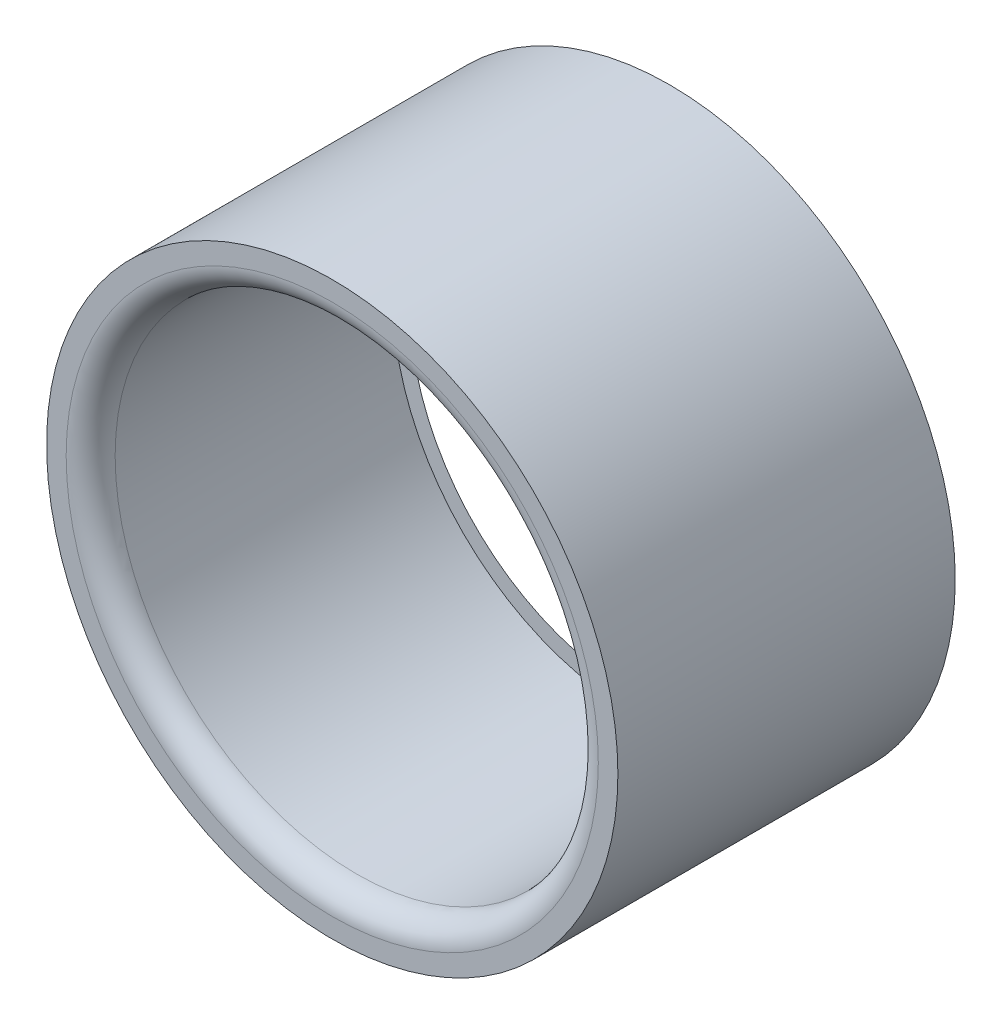
ISO-10303-21;
HEADER;
FILE_DESCRIPTION(('STEP AP214'),'2;1');
FILE_NAME('part.step','',(''),(''),'','','');
FILE_SCHEMA(('AUTOMOTIVE_DESIGN { 1 0 10303 214 1 1 1 1 }'));
ENDSEC;
DATA;
#1=APPLICATION_CONTEXT('core data for automotive mechanical design processes');
#2=APPLICATION_PROTOCOL_DEFINITION('international standard','automotive_design',2000,#1);
#3=PRODUCT_CONTEXT('',#1,'mechanical');
#4=PRODUCT('Part','Part','',(#3));
#5=PRODUCT_RELATED_PRODUCT_CATEGORY('part','',(#4));
#6=PRODUCT_DEFINITION_FORMATION('','',#4);
#7=PRODUCT_DEFINITION_CONTEXT('part definition',#1,'design');
#8=PRODUCT_DEFINITION('design','',#6,#7);
#9=PRODUCT_DEFINITION_SHAPE('','',#8);
#10=(LENGTH_UNIT() NAMED_UNIT(*) SI_UNIT(.MILLI.,.METRE.));
#11=(NAMED_UNIT(*) PLANE_ANGLE_UNIT() SI_UNIT($,.RADIAN.));
#12=(NAMED_UNIT(*) SI_UNIT($,.STERADIAN.) SOLID_ANGLE_UNIT());
#13=UNCERTAINTY_MEASURE_WITH_UNIT(LENGTH_MEASURE(1.E-05),#10,'distance_accuracy_value','');
#14=(GEOMETRIC_REPRESENTATION_CONTEXT(3) GLOBAL_UNCERTAINTY_ASSIGNED_CONTEXT((#13)) GLOBAL_UNIT_ASSIGNED_CONTEXT((#10,
#11,#12)) REPRESENTATION_CONTEXT('',''));
#15=CARTESIAN_POINT('',(0.,0.,0.));
#16=DIRECTION('',(0.,0.,1.));
#17=DIRECTION('',(1.,0.,0.));
#18=AXIS2_PLACEMENT_3D('',#15,#16,#17);
#19=CARTESIAN_POINT('',(0.,0.,-11.5));
#20=DIRECTION('',(0.,0.,1.));
#21=DIRECTION('',(1.,0.,0.));
#22=AXIS2_PLACEMENT_3D('',#19,#20,#21);
#23=CYLINDRICAL_SURFACE('',#22,35.);
#24=CARTESIAN_POINT('',(0.,0.,25.5));
#25=DIRECTION('',(0.,0.,1.));
#26=DIRECTION('',(1.,0.,0.));
#27=AXIS2_PLACEMENT_3D('',#24,#25,#26);
#28=CIRCLE('',#27,35.);
#29=CARTESIAN_POINT('',(35.,0.,25.5));
#30=VERTEX_POINT('',#29);
#31=EDGE_CURVE('E62',#30,#30,#28,.T.);
#32=ORIENTED_EDGE('',*,*,#31,.F.);
#33=EDGE_LOOP('',(#32));
#34=FACE_BOUND('',#33,.T.);
#35=CARTESIAN_POINT('',(0.,0.,-15.8301270189222));
#36=DIRECTION('',(0.,0.,-1.));
#37=DIRECTION('',(-1.,0.,0.));
#38=AXIS2_PLACEMENT_3D('',#35,#36,#37);
#39=CIRCLE('',#38,35.);
#40=CARTESIAN_POINT('',(-35.,0.,-15.8301270189222));
#41=VERTEX_POINT('',#40);
#42=EDGE_CURVE('E77',#41,#41,#39,.T.);
#43=ORIENTED_EDGE('',*,*,#42,.F.);
#44=EDGE_LOOP('',(#43));
#45=FACE_BOUND('',#44,.T.);
#46=ADVANCED_FACE('F49',(#34,#45),#23,.T.);
#47=CARTESIAN_POINT('',(0.,0.,-6.));
#48=DIRECTION('',(0.,0.,1.));
#49=DIRECTION('',(1.,0.,0.));
#50=AXIS2_PLACEMENT_3D('',#47,#48,#49);
#51=CYLINDRICAL_SURFACE('',#50,29.6);
#52=CARTESIAN_POINT('',(0.,0.,22.5));
#53=DIRECTION('',(0.,0.,1.));
#54=DIRECTION('',(1.,0.,0.));
#55=AXIS2_PLACEMENT_3D('',#52,#53,#54);
#56=CIRCLE('',#55,29.6);
#57=CARTESIAN_POINT('',(29.6,0.,22.5));
#58=VERTEX_POINT('',#57);
#59=EDGE_CURVE('E57',#58,#58,#56,.T.);
#60=ORIENTED_EDGE('',*,*,#59,.T.);
#61=EDGE_LOOP('',(#60));
#62=FACE_BOUND('',#61,.T.);
#63=CARTESIAN_POINT('',(0.,0.,-11.5));
#64=DIRECTION('',(0.,0.,1.));
#65=DIRECTION('',(1.,0.,0.));
#66=AXIS2_PLACEMENT_3D('',#63,#64,#65);
#67=CIRCLE('',#66,29.6);
#68=CARTESIAN_POINT('',(29.6,0.,-11.5));
#69=VERTEX_POINT('',#68);
#70=EDGE_CURVE('E67',#69,#69,#67,.T.);
#71=ORIENTED_EDGE('',*,*,#70,.F.);
#72=EDGE_LOOP('',(#71));
#73=FACE_BOUND('',#72,.T.);
#74=ADVANCED_FACE('F86',(#62,#73),#51,.F.);
#75=CARTESIAN_POINT('',(0.,0.,25.5));
#76=DIRECTION('',(0.,0.,1.));
#77=DIRECTION('',(1.,0.,0.));
#78=AXIS2_PLACEMENT_3D('',#75,#76,#77);
#79=PLANE('',#78);
#80=CARTESIAN_POINT('',(0.,0.,25.5));
#81=DIRECTION('',(0.,0.,1.));
#82=DIRECTION('',(1.,0.,0.));
#83=AXIS2_PLACEMENT_3D('',#80,#81,#82);
#84=CIRCLE('',#83,32.6);
#85=CARTESIAN_POINT('',(32.6,0.,25.5));
#86=VERTEX_POINT('',#85);
#87=EDGE_CURVE('E11',#86,#86,#84,.F.);
#88=ORIENTED_EDGE('',*,*,#87,.T.);
#89=EDGE_LOOP('',(#88));
#90=FACE_BOUND('',#89,.T.);
#91=ORIENTED_EDGE('',*,*,#31,.T.);
#92=EDGE_LOOP('',(#91));
#93=FACE_BOUND('',#92,.T.);
#94=ADVANCED_FACE('F92',(#90,#93),#79,.T.);
#95=CARTESIAN_POINT('',(-35.,0.,-11.5));
#96=DIRECTION('',(0.,0.,1.));
#97=DIRECTION('',(1.,0.,0.));
#98=AXIS2_PLACEMENT_3D('',#95,#96,#97);
#99=PLANE('',#98);
#100=CARTESIAN_POINT('',(0.,0.,-11.5));
#101=DIRECTION('',(0.,0.,-1.));
#102=DIRECTION('',(-1.,0.,0.));
#103=AXIS2_PLACEMENT_3D('',#100,#101,#102);
#104=CIRCLE('',#103,27.5);
#105=CARTESIAN_POINT('',(-27.5,0.,-11.5));
#106=VERTEX_POINT('',#105);
#107=EDGE_CURVE('E73',#106,#106,#104,.T.);
#108=ORIENTED_EDGE('',*,*,#107,.T.);
#109=EDGE_LOOP('',(#108));
#110=FACE_BOUND('',#109,.T.);
#111=ORIENTED_EDGE('',*,*,#70,.T.);
#112=EDGE_LOOP('',(#111));
#113=FACE_BOUND('',#112,.T.);
#114=ADVANCED_FACE('F96',(#110,#113),#99,.T.);
#115=CARTESIAN_POINT('',(0.,0.,-11.5));
#116=DIRECTION('',(0.,0.,-1.));
#117=DIRECTION('',(-1.,0.,0.));
#118=AXIS2_PLACEMENT_3D('',#115,#116,#117);
#119=CONICAL_SURFACE('',#118,27.5,1.0471975511966);
#120=ORIENTED_EDGE('',*,*,#42,.T.);
#121=EDGE_LOOP('',(#120));
#122=FACE_BOUND('',#121,.T.);
#123=ORIENTED_EDGE('',*,*,#107,.F.);
#124=EDGE_LOOP('',(#123));
#125=FACE_BOUND('',#124,.T.);
#126=ADVANCED_FACE('F82',(#122,#125),#119,.F.);
#127=CARTESIAN_POINT('',(0.,0.,22.5));
#128=DIRECTION('',(0.,0.,1.));
#129=DIRECTION('',(1.,0.,0.));
#130=AXIS2_PLACEMENT_3D('',#127,#128,#129);
#131=TOROIDAL_SURFACE('',#130,32.6,3.);
#132=ORIENTED_EDGE('',*,*,#87,.F.);
#133=EDGE_LOOP('',(#132));
#134=FACE_BOUND('',#133,.T.);
#135=ORIENTED_EDGE('',*,*,#59,.F.);
#136=EDGE_LOOP('',(#135));
#137=FACE_BOUND('',#136,.T.);
#138=ADVANCED_FACE('F51',(#134,#137),#131,.T.);
#139=CLOSED_SHELL('',(#46,#74,#94,#114,#126,#138));
#140=MANIFOLD_SOLID_BREP('B2',#139);
#141=ADVANCED_BREP_SHAPE_REPRESENTATION('',(#18,#140),#14);
#142=SHAPE_DEFINITION_REPRESENTATION(#9,#141);
ENDSEC;
END-ISO-10303-21;
